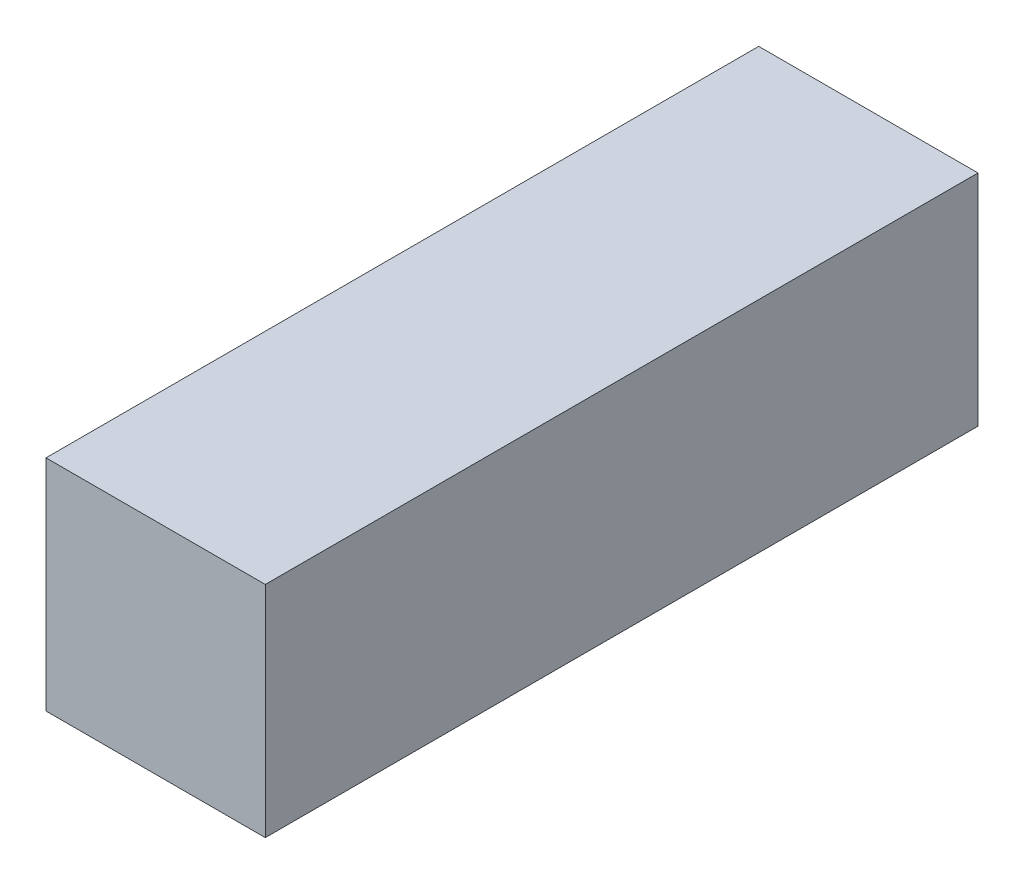
ISO-10303-21;
HEADER;
FILE_DESCRIPTION(('STEP AP214'),'2;1');
FILE_NAME('part.step','',(''),(''),'','','');
FILE_SCHEMA(('AUTOMOTIVE_DESIGN { 1 0 10303 214 1 1 1 1 }'));
ENDSEC;
DATA;
#1=APPLICATION_CONTEXT('core data for automotive mechanical design processes');
#2=APPLICATION_PROTOCOL_DEFINITION('international standard','automotive_design',2000,#1);
#3=PRODUCT_CONTEXT('',#1,'mechanical');
#4=PRODUCT('Part','Part','',(#3));
#5=PRODUCT_RELATED_PRODUCT_CATEGORY('part','',(#4));
#6=PRODUCT_DEFINITION_FORMATION('','',#4);
#7=PRODUCT_DEFINITION_CONTEXT('part definition',#1,'design');
#8=PRODUCT_DEFINITION('design','',#6,#7);
#9=PRODUCT_DEFINITION_SHAPE('','',#8);
#10=(LENGTH_UNIT() NAMED_UNIT(*) SI_UNIT(.MILLI.,.METRE.));
#11=(NAMED_UNIT(*) PLANE_ANGLE_UNIT() SI_UNIT($,.RADIAN.));
#12=(NAMED_UNIT(*) SI_UNIT($,.STERADIAN.) SOLID_ANGLE_UNIT());
#13=UNCERTAINTY_MEASURE_WITH_UNIT(LENGTH_MEASURE(1.E-05),#10,'distance_accuracy_value','');
#14=(GEOMETRIC_REPRESENTATION_CONTEXT(3) GLOBAL_UNCERTAINTY_ASSIGNED_CONTEXT((#13)) GLOBAL_UNIT_ASSIGNED_CONTEXT((#10,
#11,#12)) REPRESENTATION_CONTEXT('',''));
#15=CARTESIAN_POINT('',(0.,0.,0.));
#16=DIRECTION('',(0.,0.,1.));
#17=DIRECTION('',(1.,0.,0.));
#18=AXIS2_PLACEMENT_3D('',#15,#16,#17);
#19=CARTESIAN_POINT('',(-10.,10.,65.));
#20=DIRECTION('',(1.,0.,0.));
#21=DIRECTION('',(0.,0.,-1.));
#22=AXIS2_PLACEMENT_3D('',#19,#20,#21);
#23=PLANE('',#22);
#24=DIRECTION('',(0.,-1.,0.));
#25=VECTOR('',#24,1.);
#26=CARTESIAN_POINT('',(-10.,10.,0.));
#27=LINE('',#26,#25);
#28=CARTESIAN_POINT('',(-10.,10.,0.));
#29=VERTEX_POINT('',#28);
#30=CARTESIAN_POINT('',(-10.,-10.,0.));
#31=VERTEX_POINT('',#30);
#32=EDGE_CURVE('E101',#29,#31,#27,.T.);
#33=ORIENTED_EDGE('',*,*,#32,.T.);
#34=DIRECTION('',(0.,0.,-1.));
#35=VECTOR('',#34,1.);
#36=CARTESIAN_POINT('',(-10.,-10.,65.));
#37=LINE('',#36,#35);
#38=CARTESIAN_POINT('',(-10.,-10.,65.));
#39=VERTEX_POINT('',#38);
#40=EDGE_CURVE('E11',#39,#31,#37,.T.);
#41=ORIENTED_EDGE('',*,*,#40,.F.);
#42=DIRECTION('',(0.,-1.,0.));
#43=VECTOR('',#42,1.);
#44=CARTESIAN_POINT('',(-10.,10.,65.));
#45=LINE('',#44,#43);
#46=CARTESIAN_POINT('',(-10.,10.,65.));
#47=VERTEX_POINT('',#46);
#48=EDGE_CURVE('E89',#47,#39,#45,.T.);
#49=ORIENTED_EDGE('',*,*,#48,.F.);
#50=DIRECTION('',(0.,0.,-1.));
#51=VECTOR('',#50,1.);
#52=CARTESIAN_POINT('',(-10.,10.,65.));
#53=LINE('',#52,#51);
#54=EDGE_CURVE('E97',#47,#29,#53,.T.);
#55=ORIENTED_EDGE('',*,*,#54,.T.);
#56=EDGE_LOOP('',(#33,#41,#49,#55));
#57=FACE_BOUND('',#56,.T.);
#58=ADVANCED_FACE('F38',(#57),#23,.F.);
#59=CARTESIAN_POINT('',(-10.,-10.,65.));
#60=DIRECTION('',(0.,1.,0.));
#61=DIRECTION('',(0.,0.,1.));
#62=AXIS2_PLACEMENT_3D('',#59,#60,#61);
#63=PLANE('',#62);
#64=DIRECTION('',(1.,0.,0.));
#65=VECTOR('',#64,1.);
#66=CARTESIAN_POINT('',(-10.,-10.,0.));
#67=LINE('',#66,#65);
#68=CARTESIAN_POINT('',(10.,-10.,0.));
#69=VERTEX_POINT('',#68);
#70=EDGE_CURVE('E93',#31,#69,#67,.T.);
#71=ORIENTED_EDGE('',*,*,#70,.T.);
#72=DIRECTION('',(0.,0.,-1.));
#73=VECTOR('',#72,1.);
#74=CARTESIAN_POINT('',(10.,-10.,65.));
#75=LINE('',#74,#73);
#76=CARTESIAN_POINT('',(10.,-10.,65.));
#77=VERTEX_POINT('',#76);
#78=EDGE_CURVE('E46',#77,#69,#75,.T.);
#79=ORIENTED_EDGE('',*,*,#78,.F.);
#80=DIRECTION('',(1.,0.,0.));
#81=VECTOR('',#80,1.);
#82=CARTESIAN_POINT('',(-10.,-10.,65.));
#83=LINE('',#82,#81);
#84=EDGE_CURVE('E84',#39,#77,#83,.T.);
#85=ORIENTED_EDGE('',*,*,#84,.F.);
#86=ORIENTED_EDGE('',*,*,#40,.T.);
#87=EDGE_LOOP('',(#71,#79,#85,#86));
#88=FACE_BOUND('',#87,.T.);
#89=ADVANCED_FACE('F92',(#88),#63,.F.);
#90=CARTESIAN_POINT('',(10.,10.,65.));
#91=DIRECTION('',(-1.,0.,0.));
#92=DIRECTION('',(0.,-1.,0.));
#93=AXIS2_PLACEMENT_3D('',#90,#91,#92);
#94=PLANE('',#93);
#95=DIRECTION('',(0.,1.,0.));
#96=VECTOR('',#95,1.);
#97=CARTESIAN_POINT('',(10.,10.,0.));
#98=LINE('',#97,#96);
#99=CARTESIAN_POINT('',(10.,10.,0.));
#100=VERTEX_POINT('',#99);
#101=EDGE_CURVE('E71',#69,#100,#98,.T.);
#102=ORIENTED_EDGE('',*,*,#101,.T.);
#103=DIRECTION('',(0.,0.,-1.));
#104=VECTOR('',#103,1.);
#105=CARTESIAN_POINT('',(10.,10.,65.));
#106=LINE('',#105,#104);
#107=CARTESIAN_POINT('',(10.,10.,65.));
#108=VERTEX_POINT('',#107);
#109=EDGE_CURVE('E94',#108,#100,#106,.T.);
#110=ORIENTED_EDGE('',*,*,#109,.F.);
#111=DIRECTION('',(0.,1.,0.));
#112=VECTOR('',#111,1.);
#113=CARTESIAN_POINT('',(10.,10.,65.));
#114=LINE('',#113,#112);
#115=EDGE_CURVE('E87',#77,#108,#114,.T.);
#116=ORIENTED_EDGE('',*,*,#115,.F.);
#117=ORIENTED_EDGE('',*,*,#78,.T.);
#118=EDGE_LOOP('',(#102,#110,#116,#117));
#119=FACE_BOUND('',#118,.T.);
#120=ADVANCED_FACE('F95',(#119),#94,.F.);
#121=CARTESIAN_POINT('',(-10.,10.,65.));
#122=DIRECTION('',(0.,-1.,0.));
#123=DIRECTION('',(0.,0.,-1.));
#124=AXIS2_PLACEMENT_3D('',#121,#122,#123);
#125=PLANE('',#124);
#126=DIRECTION('',(-1.,0.,0.));
#127=VECTOR('',#126,1.);
#128=CARTESIAN_POINT('',(-10.,10.,0.));
#129=LINE('',#128,#127);
#130=EDGE_CURVE('E77',#100,#29,#129,.T.);
#131=ORIENTED_EDGE('',*,*,#130,.T.);
#132=ORIENTED_EDGE('',*,*,#54,.F.);
#133=DIRECTION('',(-1.,0.,0.));
#134=VECTOR('',#133,1.);
#135=CARTESIAN_POINT('',(-10.,10.,65.));
#136=LINE('',#135,#134);
#137=EDGE_CURVE('E54',#108,#47,#136,.T.);
#138=ORIENTED_EDGE('',*,*,#137,.F.);
#139=ORIENTED_EDGE('',*,*,#109,.T.);
#140=EDGE_LOOP('',(#131,#132,#138,#139));
#141=FACE_BOUND('',#140,.T.);
#142=ADVANCED_FACE('F108',(#141),#125,.F.);
#143=CARTESIAN_POINT('',(0.,0.,65.));
#144=DIRECTION('',(0.,0.,1.));
#145=DIRECTION('',(1.,0.,0.));
#146=AXIS2_PLACEMENT_3D('',#143,#144,#145);
#147=PLANE('',#146);
#148=ORIENTED_EDGE('',*,*,#48,.T.);
#149=ORIENTED_EDGE('',*,*,#84,.T.);
#150=ORIENTED_EDGE('',*,*,#115,.T.);
#151=ORIENTED_EDGE('',*,*,#137,.T.);
#152=EDGE_LOOP('',(#148,#149,#150,#151));
#153=FACE_BOUND('',#152,.T.);
#154=ADVANCED_FACE('F85',(#153),#147,.T.);
#155=CARTESIAN_POINT('',(0.,0.,0.));
#156=DIRECTION('',(0.,0.,1.));
#157=DIRECTION('',(1.,0.,0.));
#158=AXIS2_PLACEMENT_3D('',#155,#156,#157);
#159=PLANE('',#158);
#160=ORIENTED_EDGE('',*,*,#32,.F.);
#161=ORIENTED_EDGE('',*,*,#130,.F.);
#162=ORIENTED_EDGE('',*,*,#101,.F.);
#163=ORIENTED_EDGE('',*,*,#70,.F.);
#164=EDGE_LOOP('',(#160,#161,#162,#163));
#165=FACE_BOUND('',#164,.T.);
#166=ADVANCED_FACE('F111',(#165),#159,.F.);
#167=CLOSED_SHELL('',(#58,#89,#120,#142,#154,#166));
#168=MANIFOLD_SOLID_BREP('B2',#167);
#169=ADVANCED_BREP_SHAPE_REPRESENTATION('',(#18,#168),#14);
#170=SHAPE_DEFINITION_REPRESENTATION(#9,#169);
ENDSEC;
END-ISO-10303-21;
